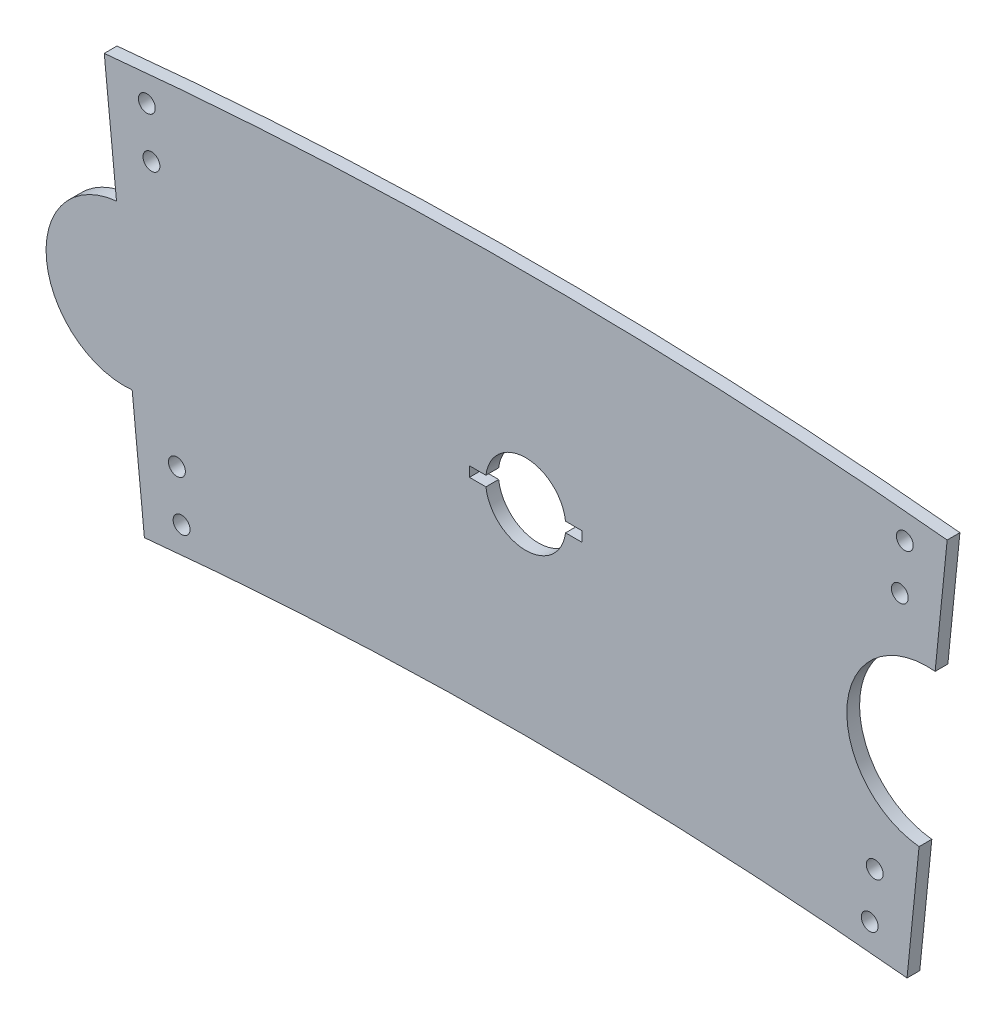
ISO-10303-21;
HEADER;
FILE_DESCRIPTION(('STEP AP214'),'2;1');
FILE_NAME('part.step','',(''),(''),'','','');
FILE_SCHEMA(('AUTOMOTIVE_DESIGN { 1 0 10303 214 1 1 1 1 }'));
ENDSEC;
DATA;
#1=APPLICATION_CONTEXT('core data for automotive mechanical design processes');
#2=APPLICATION_PROTOCOL_DEFINITION('international standard','automotive_design',2000,#1);
#3=PRODUCT_CONTEXT('',#1,'mechanical');
#4=PRODUCT('Part','Part','',(#3));
#5=PRODUCT_RELATED_PRODUCT_CATEGORY('part','',(#4));
#6=PRODUCT_DEFINITION_FORMATION('','',#4);
#7=PRODUCT_DEFINITION_CONTEXT('part definition',#1,'design');
#8=PRODUCT_DEFINITION('design','',#6,#7);
#9=PRODUCT_DEFINITION_SHAPE('','',#8);
#10=(LENGTH_UNIT() NAMED_UNIT(*) SI_UNIT(.MILLI.,.METRE.));
#11=(NAMED_UNIT(*) PLANE_ANGLE_UNIT() SI_UNIT($,.RADIAN.));
#12=(NAMED_UNIT(*) SI_UNIT($,.STERADIAN.) SOLID_ANGLE_UNIT());
#13=UNCERTAINTY_MEASURE_WITH_UNIT(LENGTH_MEASURE(1.E-05),#10,'distance_accuracy_value','');
#14=(GEOMETRIC_REPRESENTATION_CONTEXT(3) GLOBAL_UNCERTAINTY_ASSIGNED_CONTEXT((#13)) GLOBAL_UNIT_ASSIGNED_CONTEXT((#10,
#11,#12)) REPRESENTATION_CONTEXT('',''));
#15=CARTESIAN_POINT('',(0.,0.,0.));
#16=DIRECTION('',(0.,0.,1.));
#17=DIRECTION('',(1.,0.,0.));
#18=AXIS2_PLACEMENT_3D('',#15,#16,#17);
#19=CARTESIAN_POINT('',(0.,-1000.,3.175));
#20=DIRECTION('',(0.,0.,1.));
#21=DIRECTION('',(1.,0.,0.));
#22=AXIS2_PLACEMENT_3D('',#19,#20,#21);
#23=PLANE('',#22);
#24=CARTESIAN_POINT('',(-93.2394907417698,27.2898067623948,3.175));
#25=DIRECTION('',(0.,0.,1.));
#26=DIRECTION('',(1.,0.,0.));
#27=AXIS2_PLACEMENT_3D('',#24,#25,#26);
#28=CIRCLE('',#27,2.1);
#29=CARTESIAN_POINT('',(-91.1394907417698,27.2898067623948,3.175));
#30=VERTEX_POINT('',#29);
#31=EDGE_CURVE('E480',#30,#30,#28,.T.);
#32=ORIENTED_EDGE('',*,*,#31,.F.);
#33=EDGE_LOOP('',(#32));
#34=FACE_BOUND('',#33,.T.);
#35=CARTESIAN_POINT('',(-86.8968404978936,-35.3901921819157,3.175));
#36=DIRECTION('',(0.,0.,1.));
#37=DIRECTION('',(1.,0.,0.));
#38=AXIS2_PLACEMENT_3D('',#35,#36,#37);
#39=CIRCLE('',#38,2.1);
#40=CARTESIAN_POINT('',(-84.7968404978936,-35.3901921819157,3.175));
#41=VERTEX_POINT('',#40);
#42=EDGE_CURVE('E482',#41,#41,#39,.T.);
#43=ORIENTED_EDGE('',*,*,#42,.F.);
#44=EDGE_LOOP('',(#43));
#45=FACE_BOUND('',#44,.T.);
#46=CARTESIAN_POINT('',(-85.7394907417698,-47.334251020602,3.175));
#47=DIRECTION('',(0.,0.,1.));
#48=DIRECTION('',(1.,0.,0.));
#49=AXIS2_PLACEMENT_3D('',#46,#47,#48);
#50=CIRCLE('',#49,2.1);
#51=CARTESIAN_POINT('',(-83.6394907417698,-47.334251020602,3.175));
#52=VERTEX_POINT('',#51);
#53=EDGE_CURVE('E436',#52,#52,#50,.T.);
#54=ORIENTED_EDGE('',*,*,#53,.F.);
#55=EDGE_LOOP('',(#54));
#56=FACE_BOUND('',#55,.T.);
#57=CARTESIAN_POINT('',(85.7039755901708,-47.2590481554117,3.175));
#58=DIRECTION('',(0.,0.,1.));
#59=DIRECTION('',(1.,0.,0.));
#60=AXIS2_PLACEMENT_3D('',#57,#58,#59);
#61=CIRCLE('',#60,2.1);
#62=CARTESIAN_POINT('',(87.8039755901708,-47.2590481554117,3.175));
#63=VERTEX_POINT('',#62);
#64=EDGE_CURVE('E470',#63,#63,#61,.T.);
#65=ORIENTED_EDGE('',*,*,#64,.F.);
#66=EDGE_LOOP('',(#65));
#67=FACE_BOUND('',#66,.T.);
#68=CARTESIAN_POINT('',(86.9466105276805,-35.3235607999626,3.175));
#69=DIRECTION('',(0.,0.,1.));
#70=DIRECTION('',(1.,0.,0.));
#71=AXIS2_PLACEMENT_3D('',#68,#69,#70);
#72=CIRCLE('',#71,2.1);
#73=CARTESIAN_POINT('',(89.0466105276805,-35.3235607999626,3.175));
#74=VERTEX_POINT('',#73);
#75=EDGE_CURVE('E468',#74,#74,#72,.T.);
#76=ORIENTED_EDGE('',*,*,#75,.F.);
#77=EDGE_LOOP('',(#76));
#78=FACE_BOUND('',#77,.T.);
#79=CARTESIAN_POINT('',(93.2039755901707,27.3650096275846,3.175));
#80=DIRECTION('',(0.,0.,1.));
#81=DIRECTION('',(1.,0.,0.));
#82=AXIS2_PLACEMENT_3D('',#79,#80,#81);
#83=CIRCLE('',#82,2.1);
#84=CARTESIAN_POINT('',(95.3039755901708,27.3650096275846,3.175));
#85=VERTEX_POINT('',#84);
#86=EDGE_CURVE('E471',#85,#85,#83,.T.);
#87=ORIENTED_EDGE('',*,*,#86,.F.);
#88=EDGE_LOOP('',(#87));
#89=FACE_BOUND('',#88,.T.);
#90=CARTESIAN_POINT('',(94.4466105276804,39.3004969830335,3.175));
#91=DIRECTION('',(0.,0.,1.));
#92=DIRECTION('',(1.,0.,0.));
#93=AXIS2_PLACEMENT_3D('',#90,#91,#92);
#94=CIRCLE('',#93,2.1);
#95=CARTESIAN_POINT('',(96.5466105276804,39.3004969830335,3.175));
#96=VERTEX_POINT('',#95);
#97=EDGE_CURVE('E476',#96,#96,#94,.T.);
#98=ORIENTED_EDGE('',*,*,#97,.F.);
#99=EDGE_LOOP('',(#98));
#100=FACE_BOUND('',#99,.T.);
#101=CARTESIAN_POINT('',(-94.3968404978937,39.2338656010811,3.175));
#102=DIRECTION('',(0.,0.,1.));
#103=DIRECTION('',(1.,0.,0.));
#104=AXIS2_PLACEMENT_3D('',#101,#102,#103);
#105=CIRCLE('',#104,2.1);
#106=CARTESIAN_POINT('',(-92.2968404978937,39.2338656010811,3.175));
#107=VERTEX_POINT('',#106);
#108=EDGE_CURVE('E277',#107,#107,#105,.T.);
#109=ORIENTED_EDGE('',*,*,#108,.F.);
#110=EDGE_LOOP('',(#109));
#111=FACE_BOUND('',#110,.T.);
#112=CARTESIAN_POINT('',(0.,-1000.,3.175));
#113=DIRECTION('',(0.,0.,1.));
#114=DIRECTION('',(1.,0.,0.));
#115=AXIS2_PLACEMENT_3D('',#112,#113,#114);
#116=CIRCLE('',#115,1050.);
#117=CARTESIAN_POINT('',(105.,44.7368089619511,3.175));
#118=VERTEX_POINT('',#117);
#119=CARTESIAN_POINT('',(-105.,44.7368089619511,3.175));
#120=VERTEX_POINT('',#119);
#121=EDGE_CURVE('E220',#118,#120,#116,.T.);
#122=ORIENTED_EDGE('',*,*,#121,.T.);
#123=DIRECTION('',(0.0999999999999999,-0.99498743710662,0.));
#124=VECTOR('',#123,1.);
#125=CARTESIAN_POINT('',(-105.,44.7368089619511,3.175));
#126=LINE('',#125,#124);
#127=CARTESIAN_POINT('',(-101.95,14.3896921301988,3.175));
#128=VERTEX_POINT('',#127);
#129=EDGE_CURVE('E223',#120,#128,#126,.T.);
#130=ORIENTED_EDGE('',*,*,#129,.T.);
#131=CARTESIAN_POINT('',(-100.,-5.01256289338002,3.175));
#132=DIRECTION('',(0.,0.,1.));
#133=DIRECTION('',(1.,0.,0.));
#134=AXIS2_PLACEMENT_3D('',#131,#132,#133);
#135=CIRCLE('',#134,19.4999999999998);
#136=CARTESIAN_POINT('',(-98.05,-24.4148179169587,3.175));
#137=VERTEX_POINT('',#136);
#138=EDGE_CURVE('E226',#128,#137,#135,.T.);
#139=ORIENTED_EDGE('',*,*,#138,.T.);
#140=DIRECTION('',(0.0999999999999998,-0.99498743710662,0.));
#141=VECTOR('',#140,1.);
#142=CARTESIAN_POINT('',(-98.05,-24.4148179169587,3.175));
#143=LINE('',#142,#141);
#144=CARTESIAN_POINT('',(-95.0000000000001,-54.761934748711,3.175));
#145=VERTEX_POINT('',#144);
#146=EDGE_CURVE('E228',#137,#145,#143,.T.);
#147=ORIENTED_EDGE('',*,*,#146,.T.);
#148=CARTESIAN_POINT('',(0.,-1000.,3.175));
#149=DIRECTION('',(0.,0.,-1.));
#150=DIRECTION('',(1.,0.,0.));
#151=AXIS2_PLACEMENT_3D('',#148,#149,#150);
#152=CIRCLE('',#151,950.);
#153=CARTESIAN_POINT('',(95.,-54.761934748711,3.175));
#154=VERTEX_POINT('',#153);
#155=EDGE_CURVE('E230',#145,#154,#152,.T.);
#156=ORIENTED_EDGE('',*,*,#155,.T.);
#157=DIRECTION('',(0.0999999999999995,0.99498743710662,0.));
#158=VECTOR('',#157,1.);
#159=CARTESIAN_POINT('',(95.,-54.761934748711,3.175));
#160=LINE('',#159,#158);
#161=CARTESIAN_POINT('',(98.,-24.9123116355124,3.175));
#162=VERTEX_POINT('',#161);
#163=EDGE_CURVE('E232',#154,#162,#160,.T.);
#164=ORIENTED_EDGE('',*,*,#163,.T.);
#165=CARTESIAN_POINT('',(100.,-5.01256289338,3.175));
#166=DIRECTION('',(0.,0.,-1.));
#167=DIRECTION('',(1.,0.,0.));
#168=AXIS2_PLACEMENT_3D('',#165,#166,#167);
#169=CIRCLE('',#168,20.);
#170=CARTESIAN_POINT('',(102.,14.8871858487524,3.175));
#171=VERTEX_POINT('',#170);
#172=EDGE_CURVE('E234',#162,#171,#169,.T.);
#173=ORIENTED_EDGE('',*,*,#172,.T.);
#174=DIRECTION('',(0.0999999999999997,0.99498743710662,0.));
#175=VECTOR('',#174,1.);
#176=CARTESIAN_POINT('',(105.,44.7368089619511,3.175));
#177=LINE('',#176,#175);
#178=EDGE_CURVE('E236',#171,#118,#177,.T.);
#179=ORIENTED_EDGE('',*,*,#178,.T.);
#180=EDGE_LOOP('',(#122,#130,#139,#147,#156,#164,#173,#179));
#181=FACE_BOUND('',#180,.T.);
#182=CARTESIAN_POINT('',(0.,0.,3.175));
#183=DIRECTION('',(0.,0.,1.));
#184=DIRECTION('',(1.,0.,0.));
#185=AXIS2_PLACEMENT_3D('',#182,#183,#184);
#186=CIRCLE('',#185,10.);
#187=CARTESIAN_POINT('',(9.92156741649221,1.25,3.175));
#188=VERTEX_POINT('',#187);
#189=CARTESIAN_POINT('',(-9.92156741649221,1.25,3.175));
#190=VERTEX_POINT('',#189);
#191=EDGE_CURVE('E162',#188,#190,#186,.T.);
#192=ORIENTED_EDGE('',*,*,#191,.F.);
#193=DIRECTION('',(-1.,0.,0.));
#194=VECTOR('',#193,1.);
#195=CARTESIAN_POINT('',(9.92156741649221,1.25,3.175));
#196=LINE('',#195,#194);
#197=CARTESIAN_POINT('',(14.0215674164922,1.25,3.175));
#198=VERTEX_POINT('',#197);
#199=EDGE_CURVE('E154',#198,#188,#196,.T.);
#200=ORIENTED_EDGE('',*,*,#199,.F.);
#201=DIRECTION('',(0.,1.,0.));
#202=VECTOR('',#201,1.);
#203=CARTESIAN_POINT('',(14.0215674164922,1.25,3.175));
#204=LINE('',#203,#202);
#205=CARTESIAN_POINT('',(14.0215674164922,-1.24999999999997,3.175));
#206=VERTEX_POINT('',#205);
#207=EDGE_CURVE('E188',#206,#198,#204,.T.);
#208=ORIENTED_EDGE('',*,*,#207,.F.);
#209=DIRECTION('',(1.,0.,0.));
#210=VECTOR('',#209,1.);
#211=CARTESIAN_POINT('',(14.0215674164922,-1.25,3.175));
#212=LINE('',#211,#210);
#213=CARTESIAN_POINT('',(9.92156741649221,-1.25,3.175));
#214=VERTEX_POINT('',#213);
#215=EDGE_CURVE('E186',#214,#206,#212,.T.);
#216=ORIENTED_EDGE('',*,*,#215,.F.);
#217=CARTESIAN_POINT('',(0.,0.,3.175));
#218=DIRECTION('',(0.,0.,1.));
#219=DIRECTION('',(1.,0.,0.));
#220=AXIS2_PLACEMENT_3D('',#217,#218,#219);
#221=CIRCLE('',#220,10.);
#222=CARTESIAN_POINT('',(-9.92156741649221,-1.25,3.175));
#223=VERTEX_POINT('',#222);
#224=EDGE_CURVE('E184',#223,#214,#221,.T.);
#225=ORIENTED_EDGE('',*,*,#224,.F.);
#226=DIRECTION('',(1.,0.,0.));
#227=VECTOR('',#226,1.);
#228=CARTESIAN_POINT('',(-9.92156741649221,-1.25,3.175));
#229=LINE('',#228,#227);
#230=CARTESIAN_POINT('',(-14.0215674164922,-1.25,3.175));
#231=VERTEX_POINT('',#230);
#232=EDGE_CURVE('E182',#231,#223,#229,.T.);
#233=ORIENTED_EDGE('',*,*,#232,.F.);
#234=DIRECTION('',(0.,-1.,0.));
#235=VECTOR('',#234,1.);
#236=CARTESIAN_POINT('',(-14.0215674164922,-1.25,3.175));
#237=LINE('',#236,#235);
#238=CARTESIAN_POINT('',(-14.0215674164922,1.25,3.175));
#239=VERTEX_POINT('',#238);
#240=EDGE_CURVE('E177',#239,#231,#237,.T.);
#241=ORIENTED_EDGE('',*,*,#240,.F.);
#242=DIRECTION('',(-1.,0.,0.));
#243=VECTOR('',#242,1.);
#244=CARTESIAN_POINT('',(-14.0215674164922,1.25,3.175));
#245=LINE('',#244,#243);
#246=EDGE_CURVE('E175',#190,#239,#245,.T.);
#247=ORIENTED_EDGE('',*,*,#246,.F.);
#248=EDGE_LOOP('',(#192,#200,#208,#216,#225,#233,#241,#247));
#249=FACE_BOUND('',#248,.T.);
#250=ADVANCED_FACE('F39',(#34,#45,#56,#67,#78,#89,#100,#111,#181,#249),#23,.T.);
#251=CARTESIAN_POINT('',(0.,-1000.,0.));
#252=DIRECTION('',(0.,0.,1.));
#253=DIRECTION('',(1.,0.,0.));
#254=AXIS2_PLACEMENT_3D('',#251,#252,#253);
#255=PLANE('',#254);
#256=CARTESIAN_POINT('',(-93.2394907417698,27.2898067623948,0.));
#257=DIRECTION('',(0.,0.,1.));
#258=DIRECTION('',(1.,0.,0.));
#259=AXIS2_PLACEMENT_3D('',#256,#257,#258);
#260=CIRCLE('',#259,2.1);
#261=CARTESIAN_POINT('',(-91.1394907417698,27.2898067623948,0.));
#262=VERTEX_POINT('',#261);
#263=EDGE_CURVE('E43',#262,#262,#260,.T.);
#264=ORIENTED_EDGE('',*,*,#263,.T.);
#265=EDGE_LOOP('',(#264));
#266=FACE_BOUND('',#265,.T.);
#267=CARTESIAN_POINT('',(-86.8968404978936,-35.3901921819157,0.));
#268=DIRECTION('',(0.,0.,1.));
#269=DIRECTION('',(1.,0.,0.));
#270=AXIS2_PLACEMENT_3D('',#267,#268,#269);
#271=CIRCLE('',#270,2.1);
#272=CARTESIAN_POINT('',(-84.7968404978936,-35.3901921819157,0.));
#273=VERTEX_POINT('',#272);
#274=EDGE_CURVE('E291',#273,#273,#271,.T.);
#275=ORIENTED_EDGE('',*,*,#274,.T.);
#276=EDGE_LOOP('',(#275));
#277=FACE_BOUND('',#276,.T.);
#278=CARTESIAN_POINT('',(-85.7394907417698,-47.334251020602,0.));
#279=DIRECTION('',(0.,0.,1.));
#280=DIRECTION('',(1.,0.,0.));
#281=AXIS2_PLACEMENT_3D('',#278,#279,#280);
#282=CIRCLE('',#281,2.1);
#283=CARTESIAN_POINT('',(-83.6394907417698,-47.334251020602,0.));
#284=VERTEX_POINT('',#283);
#285=EDGE_CURVE('E289',#284,#284,#282,.T.);
#286=ORIENTED_EDGE('',*,*,#285,.T.);
#287=EDGE_LOOP('',(#286));
#288=FACE_BOUND('',#287,.T.);
#289=CARTESIAN_POINT('',(85.7039755901708,-47.2590481554117,0.));
#290=DIRECTION('',(0.,0.,1.));
#291=DIRECTION('',(1.,0.,0.));
#292=AXIS2_PLACEMENT_3D('',#289,#290,#291);
#293=CIRCLE('',#292,2.1);
#294=CARTESIAN_POINT('',(87.8039755901708,-47.2590481554117,0.));
#295=VERTEX_POINT('',#294);
#296=EDGE_CURVE('E286',#295,#295,#293,.T.);
#297=ORIENTED_EDGE('',*,*,#296,.T.);
#298=EDGE_LOOP('',(#297));
#299=FACE_BOUND('',#298,.T.);
#300=CARTESIAN_POINT('',(86.9466105276805,-35.3235607999626,0.));
#301=DIRECTION('',(0.,0.,1.));
#302=DIRECTION('',(1.,0.,0.));
#303=AXIS2_PLACEMENT_3D('',#300,#301,#302);
#304=CIRCLE('',#303,2.1);
#305=CARTESIAN_POINT('',(89.0466105276805,-35.3235607999626,0.));
#306=VERTEX_POINT('',#305);
#307=EDGE_CURVE('E283',#306,#306,#304,.T.);
#308=ORIENTED_EDGE('',*,*,#307,.T.);
#309=EDGE_LOOP('',(#308));
#310=FACE_BOUND('',#309,.T.);
#311=CARTESIAN_POINT('',(93.2039755901707,27.3650096275846,0.));
#312=DIRECTION('',(0.,0.,1.));
#313=DIRECTION('',(1.,0.,0.));
#314=AXIS2_PLACEMENT_3D('',#311,#312,#313);
#315=CIRCLE('',#314,2.1);
#316=CARTESIAN_POINT('',(95.3039755901708,27.3650096275846,0.));
#317=VERTEX_POINT('',#316);
#318=EDGE_CURVE('E280',#317,#317,#315,.T.);
#319=ORIENTED_EDGE('',*,*,#318,.T.);
#320=EDGE_LOOP('',(#319));
#321=FACE_BOUND('',#320,.T.);
#322=CARTESIAN_POINT('',(94.4466105276804,39.3004969830335,0.));
#323=DIRECTION('',(0.,0.,1.));
#324=DIRECTION('',(1.,0.,0.));
#325=AXIS2_PLACEMENT_3D('',#322,#323,#324);
#326=CIRCLE('',#325,2.1);
#327=CARTESIAN_POINT('',(96.5466105276804,39.3004969830335,0.));
#328=VERTEX_POINT('',#327);
#329=EDGE_CURVE('E276',#328,#328,#326,.T.);
#330=ORIENTED_EDGE('',*,*,#329,.T.);
#331=EDGE_LOOP('',(#330));
#332=FACE_BOUND('',#331,.T.);
#333=CARTESIAN_POINT('',(-94.3968404978937,39.2338656010811,0.));
#334=DIRECTION('',(0.,0.,1.));
#335=DIRECTION('',(1.,0.,0.));
#336=AXIS2_PLACEMENT_3D('',#333,#334,#335);
#337=CIRCLE('',#336,2.1);
#338=CARTESIAN_POINT('',(-92.2968404978937,39.2338656010811,0.));
#339=VERTEX_POINT('',#338);
#340=EDGE_CURVE('E273',#339,#339,#337,.T.);
#341=ORIENTED_EDGE('',*,*,#340,.T.);
#342=EDGE_LOOP('',(#341));
#343=FACE_BOUND('',#342,.T.);
#344=CARTESIAN_POINT('',(0.,-1000.,0.));
#345=DIRECTION('',(0.,0.,1.));
#346=DIRECTION('',(1.,0.,0.));
#347=AXIS2_PLACEMENT_3D('',#344,#345,#346);
#348=CIRCLE('',#347,1050.);
#349=CARTESIAN_POINT('',(105.,44.7368089619511,0.));
#350=VERTEX_POINT('',#349);
#351=CARTESIAN_POINT('',(-105.,44.7368089619511,0.));
#352=VERTEX_POINT('',#351);
#353=EDGE_CURVE('E170',#350,#352,#348,.T.);
#354=ORIENTED_EDGE('',*,*,#353,.F.);
#355=DIRECTION('',(0.0999999999999997,0.99498743710662,0.));
#356=VECTOR('',#355,1.);
#357=CARTESIAN_POINT('',(105.,44.7368089619511,0.));
#358=LINE('',#357,#356);
#359=CARTESIAN_POINT('',(102.,14.8871858487524,0.));
#360=VERTEX_POINT('',#359);
#361=EDGE_CURVE('E224',#360,#350,#358,.T.);
#362=ORIENTED_EDGE('',*,*,#361,.F.);
#363=CARTESIAN_POINT('',(100.,-5.01256289338,0.));
#364=DIRECTION('',(0.,0.,-1.));
#365=DIRECTION('',(1.,0.,0.));
#366=AXIS2_PLACEMENT_3D('',#363,#364,#365);
#367=CIRCLE('',#366,20.);
#368=CARTESIAN_POINT('',(98.,-24.9123116355124,0.));
#369=VERTEX_POINT('',#368);
#370=EDGE_CURVE('E251',#369,#360,#367,.T.);
#371=ORIENTED_EDGE('',*,*,#370,.F.);
#372=DIRECTION('',(0.0999999999999995,0.99498743710662,0.));
#373=VECTOR('',#372,1.);
#374=CARTESIAN_POINT('',(95.,-54.761934748711,0.));
#375=LINE('',#374,#373);
#376=CARTESIAN_POINT('',(95.,-54.761934748711,0.));
#377=VERTEX_POINT('',#376);
#378=EDGE_CURVE('E249',#377,#369,#375,.T.);
#379=ORIENTED_EDGE('',*,*,#378,.F.);
#380=CARTESIAN_POINT('',(0.,-1000.,0.));
#381=DIRECTION('',(0.,0.,-1.));
#382=DIRECTION('',(1.,0.,0.));
#383=AXIS2_PLACEMENT_3D('',#380,#381,#382);
#384=CIRCLE('',#383,950.);
#385=CARTESIAN_POINT('',(-95.0000000000001,-54.761934748711,0.));
#386=VERTEX_POINT('',#385);
#387=EDGE_CURVE('E247',#386,#377,#384,.T.);
#388=ORIENTED_EDGE('',*,*,#387,.F.);
#389=DIRECTION('',(0.0999999999999998,-0.99498743710662,0.));
#390=VECTOR('',#389,1.);
#391=CARTESIAN_POINT('',(-98.05,-24.4148179169587,0.));
#392=LINE('',#391,#390);
#393=CARTESIAN_POINT('',(-98.05,-24.4148179169587,0.));
#394=VERTEX_POINT('',#393);
#395=EDGE_CURVE('E245',#394,#386,#392,.T.);
#396=ORIENTED_EDGE('',*,*,#395,.F.);
#397=CARTESIAN_POINT('',(-100.,-5.01256289338002,0.));
#398=DIRECTION('',(0.,0.,1.));
#399=DIRECTION('',(1.,0.,0.));
#400=AXIS2_PLACEMENT_3D('',#397,#398,#399);
#401=CIRCLE('',#400,19.4999999999998);
#402=CARTESIAN_POINT('',(-101.95,14.3896921301988,0.));
#403=VERTEX_POINT('',#402);
#404=EDGE_CURVE('E243',#403,#394,#401,.T.);
#405=ORIENTED_EDGE('',*,*,#404,.F.);
#406=DIRECTION('',(0.0999999999999999,-0.99498743710662,0.));
#407=VECTOR('',#406,1.);
#408=CARTESIAN_POINT('',(-105.,44.7368089619511,0.));
#409=LINE('',#408,#407);
#410=EDGE_CURVE('E241',#352,#403,#409,.T.);
#411=ORIENTED_EDGE('',*,*,#410,.F.);
#412=EDGE_LOOP('',(#354,#362,#371,#379,#388,#396,#405,#411));
#413=FACE_BOUND('',#412,.T.);
#414=DIRECTION('',(-1.,0.,0.));
#415=VECTOR('',#414,1.);
#416=CARTESIAN_POINT('',(9.92156741649221,1.25,0.));
#417=LINE('',#416,#415);
#418=CARTESIAN_POINT('',(14.0215674164922,1.24999999999997,0.));
#419=VERTEX_POINT('',#418);
#420=CARTESIAN_POINT('',(9.92156741649221,1.25,0.));
#421=VERTEX_POINT('',#420);
#422=EDGE_CURVE('E64',#419,#421,#417,.T.);
#423=ORIENTED_EDGE('',*,*,#422,.T.);
#424=CARTESIAN_POINT('',(0.,0.,0.));
#425=DIRECTION('',(0.,0.,1.));
#426=DIRECTION('',(1.,0.,0.));
#427=AXIS2_PLACEMENT_3D('',#424,#425,#426);
#428=CIRCLE('',#427,10.);
#429=CARTESIAN_POINT('',(-9.92156741649221,1.25,0.));
#430=VERTEX_POINT('',#429);
#431=EDGE_CURVE('E169',#421,#430,#428,.T.);
#432=ORIENTED_EDGE('',*,*,#431,.T.);
#433=DIRECTION('',(-1.,0.,0.));
#434=VECTOR('',#433,1.);
#435=CARTESIAN_POINT('',(-14.0215674164922,1.25,0.));
#436=LINE('',#435,#434);
#437=CARTESIAN_POINT('',(-14.0215674164922,1.25,0.));
#438=VERTEX_POINT('',#437);
#439=EDGE_CURVE('E192',#430,#438,#436,.T.);
#440=ORIENTED_EDGE('',*,*,#439,.T.);
#441=DIRECTION('',(0.,-1.,0.));
#442=VECTOR('',#441,1.);
#443=CARTESIAN_POINT('',(-14.0215674164922,-1.25,0.));
#444=LINE('',#443,#442);
#445=CARTESIAN_POINT('',(-14.0215674164922,-1.25,0.));
#446=VERTEX_POINT('',#445);
#447=EDGE_CURVE('E195',#438,#446,#444,.T.);
#448=ORIENTED_EDGE('',*,*,#447,.T.);
#449=DIRECTION('',(1.,0.,0.));
#450=VECTOR('',#449,1.);
#451=CARTESIAN_POINT('',(-9.92156741649221,-1.25,0.));
#452=LINE('',#451,#450);
#453=CARTESIAN_POINT('',(-9.92156741649221,-1.25,0.));
#454=VERTEX_POINT('',#453);
#455=EDGE_CURVE('E198',#446,#454,#452,.T.);
#456=ORIENTED_EDGE('',*,*,#455,.T.);
#457=CARTESIAN_POINT('',(0.,0.,0.));
#458=DIRECTION('',(0.,0.,1.));
#459=DIRECTION('',(1.,0.,0.));
#460=AXIS2_PLACEMENT_3D('',#457,#458,#459);
#461=CIRCLE('',#460,10.);
#462=CARTESIAN_POINT('',(9.92156741649221,-1.25,0.));
#463=VERTEX_POINT('',#462);
#464=EDGE_CURVE('E201',#454,#463,#461,.T.);
#465=ORIENTED_EDGE('',*,*,#464,.T.);
#466=DIRECTION('',(1.,0.,0.));
#467=VECTOR('',#466,1.);
#468=CARTESIAN_POINT('',(14.0215674164922,-1.25,0.));
#469=LINE('',#468,#467);
#470=CARTESIAN_POINT('',(14.0215674164922,-1.25,0.));
#471=VERTEX_POINT('',#470);
#472=EDGE_CURVE('E204',#463,#471,#469,.T.);
#473=ORIENTED_EDGE('',*,*,#472,.T.);
#474=DIRECTION('',(0.,1.,0.));
#475=VECTOR('',#474,1.);
#476=CARTESIAN_POINT('',(14.0215674164922,1.25,0.));
#477=LINE('',#476,#475);
#478=EDGE_CURVE('E163',#471,#419,#477,.T.);
#479=ORIENTED_EDGE('',*,*,#478,.T.);
#480=EDGE_LOOP('',(#423,#432,#440,#448,#456,#465,#473,#479));
#481=FACE_BOUND('',#480,.T.);
#482=ADVANCED_FACE('F298',(#266,#277,#288,#299,#310,#321,#332,#343,#413,#481),#255,.F.);
#483=CARTESIAN_POINT('',(0.,-1000.,3.175));
#484=DIRECTION('',(0.,0.,-1.));
#485=DIRECTION('',(-1.,0.,0.));
#486=AXIS2_PLACEMENT_3D('',#483,#484,#485);
#487=CYLINDRICAL_SURFACE('',#486,1050.);
#488=ORIENTED_EDGE('',*,*,#353,.T.);
#489=DIRECTION('',(0.,0.,-1.));
#490=VECTOR('',#489,1.);
#491=CARTESIAN_POINT('',(-105.,44.7368089619511,3.175));
#492=LINE('',#491,#490);
#493=EDGE_CURVE('E11',#120,#352,#492,.T.);
#494=ORIENTED_EDGE('',*,*,#493,.F.);
#495=ORIENTED_EDGE('',*,*,#121,.F.);
#496=DIRECTION('',(0.,0.,-1.));
#497=VECTOR('',#496,1.);
#498=CARTESIAN_POINT('',(105.,44.7368089619511,3.175));
#499=LINE('',#498,#497);
#500=EDGE_CURVE('E238',#118,#350,#499,.T.);
#501=ORIENTED_EDGE('',*,*,#500,.T.);
#502=EDGE_LOOP('',(#488,#494,#495,#501));
#503=FACE_BOUND('',#502,.T.);
#504=ADVANCED_FACE('F41',(#503),#487,.T.);
#505=CARTESIAN_POINT('',(-105.,44.7368089619511,3.175));
#506=DIRECTION('',(0.99498743710662,0.0999999999999999,0.));
#507=DIRECTION('',(-0.0999999999999999,0.99498743710662,0.));
#508=AXIS2_PLACEMENT_3D('',#505,#506,#507);
#509=PLANE('',#508);
#510=ORIENTED_EDGE('',*,*,#410,.T.);
#511=DIRECTION('',(0.,0.,-1.));
#512=VECTOR('',#511,1.);
#513=CARTESIAN_POINT('',(-101.95,14.3896921301988,3.175));
#514=LINE('',#513,#512);
#515=EDGE_CURVE('E48',#128,#403,#514,.T.);
#516=ORIENTED_EDGE('',*,*,#515,.F.);
#517=ORIENTED_EDGE('',*,*,#129,.F.);
#518=ORIENTED_EDGE('',*,*,#493,.T.);
#519=EDGE_LOOP('',(#510,#516,#517,#518));
#520=FACE_BOUND('',#519,.T.);
#521=ADVANCED_FACE('F348',(#520),#509,.F.);
#522=CARTESIAN_POINT('',(-100.,-5.01256289338002,3.175));
#523=DIRECTION('',(0.,0.,-1.));
#524=DIRECTION('',(-1.,0.,0.));
#525=AXIS2_PLACEMENT_3D('',#522,#523,#524);
#526=CYLINDRICAL_SURFACE('',#525,19.4999999999998);
#527=ORIENTED_EDGE('',*,*,#404,.T.);
#528=DIRECTION('',(0.,0.,-1.));
#529=VECTOR('',#528,1.);
#530=CARTESIAN_POINT('',(-98.05,-24.4148179169587,3.175));
#531=LINE('',#530,#529);
#532=EDGE_CURVE('E268',#137,#394,#531,.T.);
#533=ORIENTED_EDGE('',*,*,#532,.F.);
#534=ORIENTED_EDGE('',*,*,#138,.F.);
#535=ORIENTED_EDGE('',*,*,#515,.T.);
#536=EDGE_LOOP('',(#527,#533,#534,#535));
#537=FACE_BOUND('',#536,.T.);
#538=ADVANCED_FACE('F345',(#537),#526,.T.);
#539=CARTESIAN_POINT('',(-98.05,-24.4148179169587,3.175));
#540=DIRECTION('',(0.99498743710662,0.0999999999999998,0.));
#541=DIRECTION('',(-0.0999999999999998,0.99498743710662,0.));
#542=AXIS2_PLACEMENT_3D('',#539,#540,#541);
#543=PLANE('',#542);
#544=ORIENTED_EDGE('',*,*,#395,.T.);
#545=DIRECTION('',(0.,0.,-1.));
#546=VECTOR('',#545,1.);
#547=CARTESIAN_POINT('',(-95.0000000000001,-54.761934748711,3.175));
#548=LINE('',#547,#546);
#549=EDGE_CURVE('E265',#145,#386,#548,.T.);
#550=ORIENTED_EDGE('',*,*,#549,.F.);
#551=ORIENTED_EDGE('',*,*,#146,.F.);
#552=ORIENTED_EDGE('',*,*,#532,.T.);
#553=EDGE_LOOP('',(#544,#550,#551,#552));
#554=FACE_BOUND('',#553,.T.);
#555=ADVANCED_FACE('F341',(#554),#543,.F.);
#556=CARTESIAN_POINT('',(0.,-1000.,3.175));
#557=DIRECTION('',(0.,0.,-1.));
#558=DIRECTION('',(-1.,0.,0.));
#559=AXIS2_PLACEMENT_3D('',#556,#557,#558);
#560=CYLINDRICAL_SURFACE('',#559,950.);
#561=ORIENTED_EDGE('',*,*,#387,.T.);
#562=DIRECTION('',(0.,0.,-1.));
#563=VECTOR('',#562,1.);
#564=CARTESIAN_POINT('',(95.,-54.761934748711,3.175));
#565=LINE('',#564,#563);
#566=EDGE_CURVE('E262',#154,#377,#565,.T.);
#567=ORIENTED_EDGE('',*,*,#566,.F.);
#568=ORIENTED_EDGE('',*,*,#155,.F.);
#569=ORIENTED_EDGE('',*,*,#549,.T.);
#570=EDGE_LOOP('',(#561,#567,#568,#569));
#571=FACE_BOUND('',#570,.T.);
#572=ADVANCED_FACE('F337',(#571),#560,.F.);
#573=CARTESIAN_POINT('',(95.,-54.761934748711,3.175));
#574=DIRECTION('',(-0.99498743710662,0.0999999999999995,0.));
#575=DIRECTION('',(-0.0999999999999995,-0.99498743710662,0.));
#576=AXIS2_PLACEMENT_3D('',#573,#574,#575);
#577=PLANE('',#576);
#578=ORIENTED_EDGE('',*,*,#378,.T.);
#579=DIRECTION('',(0.,0.,-1.));
#580=VECTOR('',#579,1.);
#581=CARTESIAN_POINT('',(98.,-24.9123116355124,3.175));
#582=LINE('',#581,#580);
#583=EDGE_CURVE('E259',#162,#369,#582,.T.);
#584=ORIENTED_EDGE('',*,*,#583,.F.);
#585=ORIENTED_EDGE('',*,*,#163,.F.);
#586=ORIENTED_EDGE('',*,*,#566,.T.);
#587=EDGE_LOOP('',(#578,#584,#585,#586));
#588=FACE_BOUND('',#587,.T.);
#589=ADVANCED_FACE('F333',(#588),#577,.F.);
#590=CARTESIAN_POINT('',(100.,-5.01256289338,3.175));
#591=DIRECTION('',(0.,0.,-1.));
#592=DIRECTION('',(-1.,0.,0.));
#593=AXIS2_PLACEMENT_3D('',#590,#591,#592);
#594=CYLINDRICAL_SURFACE('',#593,20.);
#595=ORIENTED_EDGE('',*,*,#370,.T.);
#596=DIRECTION('',(0.,0.,-1.));
#597=VECTOR('',#596,1.);
#598=CARTESIAN_POINT('',(102.,14.8871858487524,3.175));
#599=LINE('',#598,#597);
#600=EDGE_CURVE('E256',#171,#360,#599,.T.);
#601=ORIENTED_EDGE('',*,*,#600,.F.);
#602=ORIENTED_EDGE('',*,*,#172,.F.);
#603=ORIENTED_EDGE('',*,*,#583,.T.);
#604=EDGE_LOOP('',(#595,#601,#602,#603));
#605=FACE_BOUND('',#604,.T.);
#606=ADVANCED_FACE('F329',(#605),#594,.F.);
#607=CARTESIAN_POINT('',(105.,44.7368089619511,3.175));
#608=DIRECTION('',(-0.99498743710662,0.0999999999999997,0.));
#609=DIRECTION('',(-0.0999999999999997,-0.99498743710662,0.));
#610=AXIS2_PLACEMENT_3D('',#607,#608,#609);
#611=PLANE('',#610);
#612=ORIENTED_EDGE('',*,*,#361,.T.);
#613=ORIENTED_EDGE('',*,*,#500,.F.);
#614=ORIENTED_EDGE('',*,*,#178,.F.);
#615=ORIENTED_EDGE('',*,*,#600,.T.);
#616=EDGE_LOOP('',(#612,#613,#614,#615));
#617=FACE_BOUND('',#616,.T.);
#618=ADVANCED_FACE('F326',(#617),#611,.F.);
#619=CARTESIAN_POINT('',(9.92156741649221,1.25,3.175));
#620=DIRECTION('',(0.,-1.,0.));
#621=DIRECTION('',(0.,0.,-1.));
#622=AXIS2_PLACEMENT_3D('',#619,#620,#621);
#623=PLANE('',#622);
#624=ORIENTED_EDGE('',*,*,#422,.F.);
#625=DIRECTION('',(0.,0.,-1.));
#626=VECTOR('',#625,1.);
#627=CARTESIAN_POINT('',(14.0215674164922,1.25,3.175));
#628=LINE('',#627,#626);
#629=EDGE_CURVE('E158',#198,#419,#628,.T.);
#630=ORIENTED_EDGE('',*,*,#629,.F.);
#631=ORIENTED_EDGE('',*,*,#199,.T.);
#632=DIRECTION('',(0.,0.,-1.));
#633=VECTOR('',#632,1.);
#634=CARTESIAN_POINT('',(9.92156741649221,1.25,3.175));
#635=LINE('',#634,#633);
#636=EDGE_CURVE('E157',#188,#421,#635,.T.);
#637=ORIENTED_EDGE('',*,*,#636,.T.);
#638=EDGE_LOOP('',(#624,#630,#631,#637));
#639=FACE_BOUND('',#638,.T.);
#640=ADVANCED_FACE('F156',(#639),#623,.T.);
#641=CARTESIAN_POINT('',(0.,0.,3.175));
#642=DIRECTION('',(0.,0.,-1.));
#643=DIRECTION('',(-1.,0.,0.));
#644=AXIS2_PLACEMENT_3D('',#641,#642,#643);
#645=CYLINDRICAL_SURFACE('',#644,10.);
#646=ORIENTED_EDGE('',*,*,#431,.F.);
#647=ORIENTED_EDGE('',*,*,#636,.F.);
#648=ORIENTED_EDGE('',*,*,#191,.T.);
#649=DIRECTION('',(0.,0.,-1.));
#650=VECTOR('',#649,1.);
#651=CARTESIAN_POINT('',(-9.92156741649221,1.25,3.175));
#652=LINE('',#651,#650);
#653=EDGE_CURVE('E171',#190,#430,#652,.T.);
#654=ORIENTED_EDGE('',*,*,#653,.T.);
#655=EDGE_LOOP('',(#646,#647,#648,#654));
#656=FACE_BOUND('',#655,.T.);
#657=ADVANCED_FACE('F166',(#656),#645,.F.);
#658=CARTESIAN_POINT('',(-14.0215674164922,1.25,3.175));
#659=DIRECTION('',(0.,-1.,0.));
#660=DIRECTION('',(1.,0.,0.));
#661=AXIS2_PLACEMENT_3D('',#658,#659,#660);
#662=PLANE('',#661);
#663=ORIENTED_EDGE('',*,*,#439,.F.);
#664=ORIENTED_EDGE('',*,*,#653,.F.);
#665=ORIENTED_EDGE('',*,*,#246,.T.);
#666=DIRECTION('',(0.,0.,-1.));
#667=VECTOR('',#666,1.);
#668=CARTESIAN_POINT('',(-14.0215674164922,1.25,3.175));
#669=LINE('',#668,#667);
#670=EDGE_CURVE('E217',#239,#438,#669,.T.);
#671=ORIENTED_EDGE('',*,*,#670,.T.);
#672=EDGE_LOOP('',(#663,#664,#665,#671));
#673=FACE_BOUND('',#672,.T.);
#674=ADVANCED_FACE('F403',(#673),#662,.T.);
#675=CARTESIAN_POINT('',(-14.0215674164922,-1.25,3.175));
#676=DIRECTION('',(1.,0.,0.));
#677=DIRECTION('',(0.,0.,-1.));
#678=AXIS2_PLACEMENT_3D('',#675,#676,#677);
#679=PLANE('',#678);
#680=ORIENTED_EDGE('',*,*,#447,.F.);
#681=ORIENTED_EDGE('',*,*,#670,.F.);
#682=ORIENTED_EDGE('',*,*,#240,.T.);
#683=DIRECTION('',(0.,0.,-1.));
#684=VECTOR('',#683,1.);
#685=CARTESIAN_POINT('',(-14.0215674164922,-1.25,3.175));
#686=LINE('',#685,#684);
#687=EDGE_CURVE('E215',#231,#446,#686,.T.);
#688=ORIENTED_EDGE('',*,*,#687,.T.);
#689=EDGE_LOOP('',(#680,#681,#682,#688));
#690=FACE_BOUND('',#689,.T.);
#691=ADVANCED_FACE('F400',(#690),#679,.T.);
#692=CARTESIAN_POINT('',(-9.92156741649221,-1.25,3.175));
#693=DIRECTION('',(0.,1.,0.));
#694=DIRECTION('',(-1.,0.,0.));
#695=AXIS2_PLACEMENT_3D('',#692,#693,#694);
#696=PLANE('',#695);
#697=ORIENTED_EDGE('',*,*,#455,.F.);
#698=ORIENTED_EDGE('',*,*,#687,.F.);
#699=ORIENTED_EDGE('',*,*,#232,.T.);
#700=DIRECTION('',(0.,0.,-1.));
#701=VECTOR('',#700,1.);
#702=CARTESIAN_POINT('',(-9.92156741649221,-1.25,3.175));
#703=LINE('',#702,#701);
#704=EDGE_CURVE('E213',#223,#454,#703,.T.);
#705=ORIENTED_EDGE('',*,*,#704,.T.);
#706=EDGE_LOOP('',(#697,#698,#699,#705));
#707=FACE_BOUND('',#706,.T.);
#708=ADVANCED_FACE('F395',(#707),#696,.T.);
#709=CARTESIAN_POINT('',(0.,0.,3.175));
#710=DIRECTION('',(0.,0.,-1.));
#711=DIRECTION('',(-1.,0.,0.));
#712=AXIS2_PLACEMENT_3D('',#709,#710,#711);
#713=CYLINDRICAL_SURFACE('',#712,10.);
#714=ORIENTED_EDGE('',*,*,#464,.F.);
#715=ORIENTED_EDGE('',*,*,#704,.F.);
#716=ORIENTED_EDGE('',*,*,#224,.T.);
#717=DIRECTION('',(0.,0.,-1.));
#718=VECTOR('',#717,1.);
#719=CARTESIAN_POINT('',(9.92156741649221,-1.25,3.175));
#720=LINE('',#719,#718);
#721=EDGE_CURVE('E211',#214,#463,#720,.T.);
#722=ORIENTED_EDGE('',*,*,#721,.T.);
#723=EDGE_LOOP('',(#714,#715,#716,#722));
#724=FACE_BOUND('',#723,.T.);
#725=ADVANCED_FACE('F391',(#724),#713,.F.);
#726=CARTESIAN_POINT('',(14.0215674164922,-1.25,3.175));
#727=DIRECTION('',(0.,1.,0.));
#728=DIRECTION('',(-1.,0.,0.));
#729=AXIS2_PLACEMENT_3D('',#726,#727,#728);
#730=PLANE('',#729);
#731=ORIENTED_EDGE('',*,*,#472,.F.);
#732=ORIENTED_EDGE('',*,*,#721,.F.);
#733=ORIENTED_EDGE('',*,*,#215,.T.);
#734=DIRECTION('',(0.,0.,-1.));
#735=VECTOR('',#734,1.);
#736=CARTESIAN_POINT('',(14.0215674164922,-1.25,3.175));
#737=LINE('',#736,#735);
#738=EDGE_CURVE('E56',#206,#471,#737,.T.);
#739=ORIENTED_EDGE('',*,*,#738,.T.);
#740=EDGE_LOOP('',(#731,#732,#733,#739));
#741=FACE_BOUND('',#740,.T.);
#742=ADVANCED_FACE('F388',(#741),#730,.T.);
#743=CARTESIAN_POINT('',(14.0215674164922,1.25,3.175));
#744=DIRECTION('',(-1.,0.,0.));
#745=DIRECTION('',(0.,0.,1.));
#746=AXIS2_PLACEMENT_3D('',#743,#744,#745);
#747=PLANE('',#746);
#748=ORIENTED_EDGE('',*,*,#478,.F.);
#749=ORIENTED_EDGE('',*,*,#738,.F.);
#750=ORIENTED_EDGE('',*,*,#207,.T.);
#751=ORIENTED_EDGE('',*,*,#629,.T.);
#752=EDGE_LOOP('',(#748,#749,#750,#751));
#753=FACE_BOUND('',#752,.T.);
#754=ADVANCED_FACE('F382',(#753),#747,.T.);
#755=CARTESIAN_POINT('',(-94.3968404978937,39.2338656010811,-6.825));
#756=DIRECTION('',(0.,0.,1.));
#757=DIRECTION('',(1.,0.,0.));
#758=AXIS2_PLACEMENT_3D('',#755,#756,#757);
#759=CYLINDRICAL_SURFACE('',#758,2.1);
#760=ORIENTED_EDGE('',*,*,#108,.T.);
#761=EDGE_LOOP('',(#760));
#762=FACE_BOUND('',#761,.T.);
#763=ORIENTED_EDGE('',*,*,#340,.F.);
#764=EDGE_LOOP('',(#763));
#765=FACE_BOUND('',#764,.T.);
#766=ADVANCED_FACE('F419',(#762,#765),#759,.F.);
#767=CARTESIAN_POINT('',(94.4466105276804,39.3004969830335,-6.825));
#768=DIRECTION('',(0.,0.,1.));
#769=DIRECTION('',(1.,0.,0.));
#770=AXIS2_PLACEMENT_3D('',#767,#768,#769);
#771=CYLINDRICAL_SURFACE('',#770,2.1);
#772=ORIENTED_EDGE('',*,*,#97,.T.);
#773=EDGE_LOOP('',(#772));
#774=FACE_BOUND('',#773,.T.);
#775=ORIENTED_EDGE('',*,*,#329,.F.);
#776=EDGE_LOOP('',(#775));
#777=FACE_BOUND('',#776,.T.);
#778=ADVANCED_FACE('F422',(#774,#777),#771,.F.);
#779=CARTESIAN_POINT('',(93.2039755901707,27.3650096275846,-6.825));
#780=DIRECTION('',(0.,0.,1.));
#781=DIRECTION('',(1.,0.,0.));
#782=AXIS2_PLACEMENT_3D('',#779,#780,#781);
#783=CYLINDRICAL_SURFACE('',#782,2.1);
#784=ORIENTED_EDGE('',*,*,#86,.T.);
#785=EDGE_LOOP('',(#784));
#786=FACE_BOUND('',#785,.T.);
#787=ORIENTED_EDGE('',*,*,#318,.F.);
#788=EDGE_LOOP('',(#787));
#789=FACE_BOUND('',#788,.T.);
#790=ADVANCED_FACE('F452',(#786,#789),#783,.F.);
#791=CARTESIAN_POINT('',(86.9466105276805,-35.3235607999626,-6.825));
#792=DIRECTION('',(0.,0.,1.));
#793=DIRECTION('',(1.,0.,0.));
#794=AXIS2_PLACEMENT_3D('',#791,#792,#793);
#795=CYLINDRICAL_SURFACE('',#794,2.1);
#796=ORIENTED_EDGE('',*,*,#75,.T.);
#797=EDGE_LOOP('',(#796));
#798=FACE_BOUND('',#797,.T.);
#799=ORIENTED_EDGE('',*,*,#307,.F.);
#800=EDGE_LOOP('',(#799));
#801=FACE_BOUND('',#800,.T.);
#802=ADVANCED_FACE('F427',(#798,#801),#795,.F.);
#803=CARTESIAN_POINT('',(85.7039755901708,-47.2590481554117,-6.825));
#804=DIRECTION('',(0.,0.,1.));
#805=DIRECTION('',(1.,0.,0.));
#806=AXIS2_PLACEMENT_3D('',#803,#804,#805);
#807=CYLINDRICAL_SURFACE('',#806,2.1);
#808=ORIENTED_EDGE('',*,*,#64,.T.);
#809=EDGE_LOOP('',(#808));
#810=FACE_BOUND('',#809,.T.);
#811=ORIENTED_EDGE('',*,*,#296,.F.);
#812=EDGE_LOOP('',(#811));
#813=FACE_BOUND('',#812,.T.);
#814=ADVANCED_FACE('F424',(#810,#813),#807,.F.);
#815=CARTESIAN_POINT('',(-85.7394907417698,-47.334251020602,-6.825));
#816=DIRECTION('',(0.,0.,1.));
#817=DIRECTION('',(1.,0.,0.));
#818=AXIS2_PLACEMENT_3D('',#815,#816,#817);
#819=CYLINDRICAL_SURFACE('',#818,2.1);
#820=ORIENTED_EDGE('',*,*,#53,.T.);
#821=EDGE_LOOP('',(#820));
#822=FACE_BOUND('',#821,.T.);
#823=ORIENTED_EDGE('',*,*,#285,.F.);
#824=EDGE_LOOP('',(#823));
#825=FACE_BOUND('',#824,.T.);
#826=ADVANCED_FACE('F308',(#822,#825),#819,.F.);
#827=CARTESIAN_POINT('',(-86.8968404978936,-35.3901921819157,-6.825));
#828=DIRECTION('',(0.,0.,1.));
#829=DIRECTION('',(1.,0.,0.));
#830=AXIS2_PLACEMENT_3D('',#827,#828,#829);
#831=CYLINDRICAL_SURFACE('',#830,2.1);
#832=ORIENTED_EDGE('',*,*,#42,.T.);
#833=EDGE_LOOP('',(#832));
#834=FACE_BOUND('',#833,.T.);
#835=ORIENTED_EDGE('',*,*,#274,.F.);
#836=EDGE_LOOP('',(#835));
#837=FACE_BOUND('',#836,.T.);
#838=ADVANCED_FACE('F302',(#834,#837),#831,.F.);
#839=CARTESIAN_POINT('',(-93.2394907417698,27.2898067623948,-6.825));
#840=DIRECTION('',(0.,0.,1.));
#841=DIRECTION('',(1.,0.,0.));
#842=AXIS2_PLACEMENT_3D('',#839,#840,#841);
#843=CYLINDRICAL_SURFACE('',#842,2.1);
#844=ORIENTED_EDGE('',*,*,#31,.T.);
#845=EDGE_LOOP('',(#844));
#846=FACE_BOUND('',#845,.T.);
#847=ORIENTED_EDGE('',*,*,#263,.F.);
#848=EDGE_LOOP('',(#847));
#849=FACE_BOUND('',#848,.T.);
#850=ADVANCED_FACE('F300',(#846,#849),#843,.F.);
#851=CLOSED_SHELL('',(#250,#482,#504,#521,#538,#555,#572,#589,#606,#618,#640,#657,#674,#691,
#708,#725,#742,#754,#766,#778,#790,#802,#814,#826,#838,#850));
#852=MANIFOLD_SOLID_BREP('B2',#851);
#853=ADVANCED_BREP_SHAPE_REPRESENTATION('',(#18,#852),#14);
#854=SHAPE_DEFINITION_REPRESENTATION(#9,#853);
ENDSEC;
END-ISO-10303-21;
